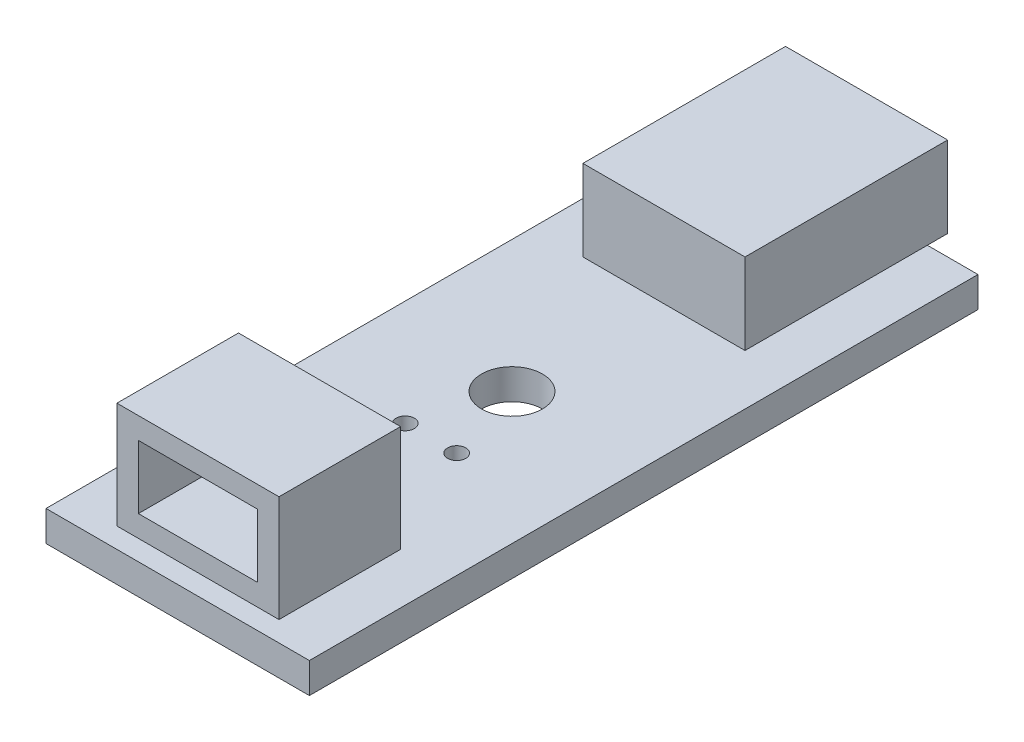
ISO-10303-21;
HEADER;
FILE_DESCRIPTION(('STEP AP214'),'2;1');
FILE_NAME('part.step','',(''),(''),'','','');
FILE_SCHEMA(('AUTOMOTIVE_DESIGN { 1 0 10303 214 1 1 1 1 }'));
ENDSEC;
DATA;
#1=APPLICATION_CONTEXT('core data for automotive mechanical design processes');
#2=APPLICATION_PROTOCOL_DEFINITION('international standard','automotive_design',2000,#1);
#3=PRODUCT_CONTEXT('',#1,'mechanical');
#4=PRODUCT('Part','Part','',(#3));
#5=PRODUCT_RELATED_PRODUCT_CATEGORY('part','',(#4));
#6=PRODUCT_DEFINITION_FORMATION('','',#4);
#7=PRODUCT_DEFINITION_CONTEXT('part definition',#1,'design');
#8=PRODUCT_DEFINITION('design','',#6,#7);
#9=PRODUCT_DEFINITION_SHAPE('','',#8);
#10=(LENGTH_UNIT() NAMED_UNIT(*) SI_UNIT(.MILLI.,.METRE.));
#11=(NAMED_UNIT(*) PLANE_ANGLE_UNIT() SI_UNIT($,.RADIAN.));
#12=(NAMED_UNIT(*) SI_UNIT($,.STERADIAN.) SOLID_ANGLE_UNIT());
#13=UNCERTAINTY_MEASURE_WITH_UNIT(LENGTH_MEASURE(1.E-05),#10,'distance_accuracy_value','');
#14=(GEOMETRIC_REPRESENTATION_CONTEXT(3) GLOBAL_UNCERTAINTY_ASSIGNED_CONTEXT((#13)) GLOBAL_UNIT_ASSIGNED_CONTEXT((#10,
#11,#12)) REPRESENTATION_CONTEXT('',''));
#15=CARTESIAN_POINT('',(0.,0.,0.));
#16=DIRECTION('',(0.,0.,1.));
#17=DIRECTION('',(1.,0.,0.));
#18=AXIS2_PLACEMENT_3D('',#15,#16,#17);
#19=CARTESIAN_POINT('',(-6.5,1.5,-16.5));
#20=DIRECTION('',(0.,0.,1.));
#21=DIRECTION('',(1.,0.,0.));
#22=AXIS2_PLACEMENT_3D('',#19,#20,#21);
#23=PLANE('',#22);
#24=DIRECTION('',(-1.,0.,0.));
#25=VECTOR('',#24,1.);
#26=CARTESIAN_POINT('',(4.,1.5,-16.5));
#27=LINE('',#26,#25);
#28=CARTESIAN_POINT('',(4.,1.5,-16.5));
#29=VERTEX_POINT('',#28);
#30=CARTESIAN_POINT('',(-4.,1.5,-16.5));
#31=VERTEX_POINT('',#30);
#32=EDGE_CURVE('E262',#29,#31,#27,.T.);
#33=ORIENTED_EDGE('',*,*,#32,.F.);
#34=DIRECTION('',(-1.,0.,0.));
#35=VECTOR('',#34,1.);
#36=CARTESIAN_POINT('',(-6.5,1.5,-16.5));
#37=LINE('',#36,#35);
#38=CARTESIAN_POINT('',(6.5,1.5,-16.5));
#39=VERTEX_POINT('',#38);
#40=EDGE_CURVE('E394',#39,#29,#37,.T.);
#41=ORIENTED_EDGE('',*,*,#40,.F.);
#42=DIRECTION('',(0.,-1.,0.));
#43=VECTOR('',#42,1.);
#44=CARTESIAN_POINT('',(6.5,1.5,-16.5));
#45=LINE('',#44,#43);
#46=CARTESIAN_POINT('',(6.5,0.,-16.5));
#47=VERTEX_POINT('',#46);
#48=EDGE_CURVE('E11',#39,#47,#45,.T.);
#49=ORIENTED_EDGE('',*,*,#48,.T.);
#50=DIRECTION('',(-1.,0.,0.));
#51=VECTOR('',#50,1.);
#52=CARTESIAN_POINT('',(-6.5,0.,-16.5));
#53=LINE('',#52,#51);
#54=CARTESIAN_POINT('',(-6.5,0.,-16.5));
#55=VERTEX_POINT('',#54);
#56=EDGE_CURVE('E404',#47,#55,#53,.T.);
#57=ORIENTED_EDGE('',*,*,#56,.T.);
#58=DIRECTION('',(0.,-1.,0.));
#59=VECTOR('',#58,1.);
#60=CARTESIAN_POINT('',(-6.5,1.5,-16.5));
#61=LINE('',#60,#59);
#62=CARTESIAN_POINT('',(-6.5,1.5,-16.5));
#63=VERTEX_POINT('',#62);
#64=EDGE_CURVE('E43',#63,#55,#61,.T.);
#65=ORIENTED_EDGE('',*,*,#64,.F.);
#66=EDGE_CURVE('E392',#31,#63,#37,.T.);
#67=ORIENTED_EDGE('',*,*,#66,.F.);
#68=EDGE_LOOP('',(#33,#41,#49,#57,#65,#67));
#69=FACE_BOUND('',#68,.T.);
#70=ADVANCED_FACE('F34',(#69),#23,.F.);
#71=CARTESIAN_POINT('',(0.,1.5,0.));
#72=DIRECTION('',(0.,-1.,0.));
#73=DIRECTION('',(0.,0.,-1.));
#74=AXIS2_PLACEMENT_3D('',#71,#72,#73);
#75=PLANE('',#74);
#76=DIRECTION('',(0.,0.,-1.));
#77=VECTOR('',#76,1.);
#78=CARTESIAN_POINT('',(4.,1.5,15.5));
#79=LINE('',#78,#77);
#80=CARTESIAN_POINT('',(4.,1.5,15.5));
#81=VERTEX_POINT('',#80);
#82=CARTESIAN_POINT('',(4.,1.5,9.5));
#83=VERTEX_POINT('',#82);
#84=EDGE_CURVE('E349',#81,#83,#79,.T.);
#85=ORIENTED_EDGE('',*,*,#84,.F.);
#86=DIRECTION('',(1.,0.,0.));
#87=VECTOR('',#86,1.);
#88=CARTESIAN_POINT('',(-4.,1.5,15.5));
#89=LINE('',#88,#87);
#90=CARTESIAN_POINT('',(-4.,1.5,15.5));
#91=VERTEX_POINT('',#90);
#92=EDGE_CURVE('E360',#91,#81,#89,.T.);
#93=ORIENTED_EDGE('',*,*,#92,.F.);
#94=DIRECTION('',(0.,0.,1.));
#95=VECTOR('',#94,1.);
#96=CARTESIAN_POINT('',(-4.,1.5,15.5));
#97=LINE('',#96,#95);
#98=CARTESIAN_POINT('',(-4.,1.5,9.5));
#99=VERTEX_POINT('',#98);
#100=EDGE_CURVE('E372',#99,#91,#97,.T.);
#101=ORIENTED_EDGE('',*,*,#100,.F.);
#102=DIRECTION('',(-1.,0.,0.));
#103=VECTOR('',#102,1.);
#104=CARTESIAN_POINT('',(-4.,1.5,9.5));
#105=LINE('',#104,#103);
#106=EDGE_CURVE('E369',#83,#99,#105,.T.);
#107=ORIENTED_EDGE('',*,*,#106,.F.);
#108=EDGE_LOOP('',(#85,#93,#101,#107));
#109=FACE_BOUND('',#108,.T.);
#110=CARTESIAN_POINT('',(0.,1.5,0.));
#111=DIRECTION('',(0.,1.,0.));
#112=DIRECTION('',(0.,0.,1.));
#113=AXIS2_PLACEMENT_3D('',#110,#111,#112);
#114=CIRCLE('',#113,1.5);
#115=CARTESIAN_POINT('',(0.,1.5,1.5));
#116=VERTEX_POINT('',#115);
#117=EDGE_CURVE('E319',#116,#116,#114,.T.);
#118=ORIENTED_EDGE('',*,*,#117,.F.);
#119=EDGE_LOOP('',(#118));
#120=FACE_BOUND('',#119,.T.);
#121=CARTESIAN_POINT('',(-1.27,1.5,4.));
#122=DIRECTION('',(0.,1.,0.));
#123=DIRECTION('',(0.,0.,1.));
#124=AXIS2_PLACEMENT_3D('',#121,#122,#123);
#125=CIRCLE('',#124,0.45);
#126=CARTESIAN_POINT('',(-1.27,1.5,4.45));
#127=VERTEX_POINT('',#126);
#128=EDGE_CURVE('E315',#127,#127,#125,.T.);
#129=ORIENTED_EDGE('',*,*,#128,.F.);
#130=EDGE_LOOP('',(#129));
#131=FACE_BOUND('',#130,.T.);
#132=CARTESIAN_POINT('',(1.27,1.5,4.));
#133=DIRECTION('',(0.,1.,0.));
#134=DIRECTION('',(0.,0.,1.));
#135=AXIS2_PLACEMENT_3D('',#132,#133,#134);
#136=CIRCLE('',#135,0.45);
#137=CARTESIAN_POINT('',(1.27,1.5,4.45));
#138=VERTEX_POINT('',#137);
#139=EDGE_CURVE('E312',#138,#138,#136,.T.);
#140=ORIENTED_EDGE('',*,*,#139,.F.);
#141=EDGE_LOOP('',(#140));
#142=FACE_BOUND('',#141,.T.);
#143=DIRECTION('',(0.,0.,1.));
#144=VECTOR('',#143,1.);
#145=CARTESIAN_POINT('',(-4.,1.5,-7.5));
#146=LINE('',#145,#144);
#147=CARTESIAN_POINT('',(-4.,1.5,-7.5));
#148=VERTEX_POINT('',#147);
#149=EDGE_CURVE('E293',#31,#148,#146,.T.);
#150=ORIENTED_EDGE('',*,*,#149,.F.);
#151=ORIENTED_EDGE('',*,*,#66,.T.);
#152=DIRECTION('',(0.,0.,1.));
#153=VECTOR('',#152,1.);
#154=CARTESIAN_POINT('',(-6.5,1.5,16.5));
#155=LINE('',#154,#153);
#156=CARTESIAN_POINT('',(-6.5,1.5,16.5));
#157=VERTEX_POINT('',#156);
#158=EDGE_CURVE('E397',#63,#157,#155,.T.);
#159=ORIENTED_EDGE('',*,*,#158,.T.);
#160=DIRECTION('',(1.,0.,0.));
#161=VECTOR('',#160,1.);
#162=CARTESIAN_POINT('',(-6.5,1.5,16.5));
#163=LINE('',#162,#161);
#164=CARTESIAN_POINT('',(6.5,1.5,16.5));
#165=VERTEX_POINT('',#164);
#166=EDGE_CURVE('E399',#157,#165,#163,.T.);
#167=ORIENTED_EDGE('',*,*,#166,.T.);
#168=DIRECTION('',(0.,0.,-1.));
#169=VECTOR('',#168,1.);
#170=CARTESIAN_POINT('',(6.5,1.5,16.5));
#171=LINE('',#170,#169);
#172=EDGE_CURVE('E389',#165,#39,#171,.T.);
#173=ORIENTED_EDGE('',*,*,#172,.T.);
#174=ORIENTED_EDGE('',*,*,#40,.T.);
#175=DIRECTION('',(0.,0.,-1.));
#176=VECTOR('',#175,1.);
#177=CARTESIAN_POINT('',(4.,1.5,-7.5));
#178=LINE('',#177,#176);
#179=CARTESIAN_POINT('',(4.,1.5,-7.5));
#180=VERTEX_POINT('',#179);
#181=EDGE_CURVE('E298',#180,#29,#178,.T.);
#182=ORIENTED_EDGE('',*,*,#181,.F.);
#183=DIRECTION('',(1.,0.,0.));
#184=VECTOR('',#183,1.);
#185=CARTESIAN_POINT('',(4.,1.5,-7.5));
#186=LINE('',#185,#184);
#187=EDGE_CURVE('E59',#148,#180,#186,.T.);
#188=ORIENTED_EDGE('',*,*,#187,.F.);
#189=EDGE_LOOP('',(#150,#151,#159,#167,#173,#174,#182,#188));
#190=FACE_BOUND('',#189,.T.);
#191=ADVANCED_FACE('F448',(#109,#120,#131,#142,#190),#75,.F.);
#192=CARTESIAN_POINT('',(6.5,1.5,16.5));
#193=DIRECTION('',(-1.,0.,0.));
#194=DIRECTION('',(0.,0.,1.));
#195=AXIS2_PLACEMENT_3D('',#192,#193,#194);
#196=PLANE('',#195);
#197=DIRECTION('',(0.,0.,-1.));
#198=VECTOR('',#197,1.);
#199=CARTESIAN_POINT('',(6.5,0.,16.5));
#200=LINE('',#199,#198);
#201=CARTESIAN_POINT('',(6.5,0.,16.5));
#202=VERTEX_POINT('',#201);
#203=EDGE_CURVE('E388',#202,#47,#200,.T.);
#204=ORIENTED_EDGE('',*,*,#203,.T.);
#205=ORIENTED_EDGE('',*,*,#48,.F.);
#206=ORIENTED_EDGE('',*,*,#172,.F.);
#207=DIRECTION('',(0.,-1.,0.));
#208=VECTOR('',#207,1.);
#209=CARTESIAN_POINT('',(6.5,1.5,16.5));
#210=LINE('',#209,#208);
#211=EDGE_CURVE('E401',#165,#202,#210,.T.);
#212=ORIENTED_EDGE('',*,*,#211,.T.);
#213=EDGE_LOOP('',(#204,#205,#206,#212));
#214=FACE_BOUND('',#213,.T.);
#215=ADVANCED_FACE('F36',(#214),#196,.F.);
#216=CARTESIAN_POINT('',(-6.5,1.5,16.5));
#217=DIRECTION('',(1.,0.,0.));
#218=DIRECTION('',(0.,0.,-1.));
#219=AXIS2_PLACEMENT_3D('',#216,#217,#218);
#220=PLANE('',#219);
#221=DIRECTION('',(0.,0.,1.));
#222=VECTOR('',#221,1.);
#223=CARTESIAN_POINT('',(-6.5,0.,16.5));
#224=LINE('',#223,#222);
#225=CARTESIAN_POINT('',(-6.5,0.,16.5));
#226=VERTEX_POINT('',#225);
#227=EDGE_CURVE('E406',#55,#226,#224,.T.);
#228=ORIENTED_EDGE('',*,*,#227,.T.);
#229=DIRECTION('',(0.,-1.,0.));
#230=VECTOR('',#229,1.);
#231=CARTESIAN_POINT('',(-6.5,1.5,16.5));
#232=LINE('',#231,#230);
#233=EDGE_CURVE('E411',#157,#226,#232,.T.);
#234=ORIENTED_EDGE('',*,*,#233,.F.);
#235=ORIENTED_EDGE('',*,*,#158,.F.);
#236=ORIENTED_EDGE('',*,*,#64,.T.);
#237=EDGE_LOOP('',(#228,#234,#235,#236));
#238=FACE_BOUND('',#237,.T.);
#239=ADVANCED_FACE('F444',(#238),#220,.F.);
#240=CARTESIAN_POINT('',(-6.5,1.5,16.5));
#241=DIRECTION('',(0.,0.,-1.));
#242=DIRECTION('',(-1.,0.,0.));
#243=AXIS2_PLACEMENT_3D('',#240,#241,#242);
#244=PLANE('',#243);
#245=DIRECTION('',(1.,0.,0.));
#246=VECTOR('',#245,1.);
#247=CARTESIAN_POINT('',(-6.5,0.,16.5));
#248=LINE('',#247,#246);
#249=EDGE_CURVE('E393',#226,#202,#248,.T.);
#250=ORIENTED_EDGE('',*,*,#249,.T.);
#251=ORIENTED_EDGE('',*,*,#211,.F.);
#252=ORIENTED_EDGE('',*,*,#166,.F.);
#253=ORIENTED_EDGE('',*,*,#233,.T.);
#254=EDGE_LOOP('',(#250,#251,#252,#253));
#255=FACE_BOUND('',#254,.T.);
#256=ADVANCED_FACE('F427',(#255),#244,.F.);
#257=CARTESIAN_POINT('',(0.,0.,0.));
#258=DIRECTION('',(0.,-1.,0.));
#259=DIRECTION('',(0.,0.,-1.));
#260=AXIS2_PLACEMENT_3D('',#257,#258,#259);
#261=PLANE('',#260);
#262=CARTESIAN_POINT('',(1.27,0.,4.));
#263=DIRECTION('',(0.,-1.,0.));
#264=DIRECTION('',(0.,0.,-1.));
#265=AXIS2_PLACEMENT_3D('',#262,#263,#264);
#266=CIRCLE('',#265,0.45);
#267=CARTESIAN_POINT('',(1.27,0.,3.55));
#268=VERTEX_POINT('',#267);
#269=EDGE_CURVE('E38',#268,#268,#266,.T.);
#270=ORIENTED_EDGE('',*,*,#269,.F.);
#271=EDGE_LOOP('',(#270));
#272=FACE_BOUND('',#271,.T.);
#273=CARTESIAN_POINT('',(-1.27,0.,4.));
#274=DIRECTION('',(0.,-1.,0.));
#275=DIRECTION('',(0.,0.,-1.));
#276=AXIS2_PLACEMENT_3D('',#273,#274,#275);
#277=CIRCLE('',#276,0.45);
#278=CARTESIAN_POINT('',(-1.27,0.,3.55));
#279=VERTEX_POINT('',#278);
#280=EDGE_CURVE('E318',#279,#279,#277,.T.);
#281=ORIENTED_EDGE('',*,*,#280,.F.);
#282=EDGE_LOOP('',(#281));
#283=FACE_BOUND('',#282,.T.);
#284=CARTESIAN_POINT('',(0.,0.,0.));
#285=DIRECTION('',(0.,-1.,0.));
#286=DIRECTION('',(0.,0.,-1.));
#287=AXIS2_PLACEMENT_3D('',#284,#285,#286);
#288=CIRCLE('',#287,1.5);
#289=CARTESIAN_POINT('',(0.,0.,-1.5));
#290=VERTEX_POINT('',#289);
#291=EDGE_CURVE('E322',#290,#290,#288,.T.);
#292=ORIENTED_EDGE('',*,*,#291,.F.);
#293=EDGE_LOOP('',(#292));
#294=FACE_BOUND('',#293,.T.);
#295=ORIENTED_EDGE('',*,*,#203,.F.);
#296=ORIENTED_EDGE('',*,*,#249,.F.);
#297=ORIENTED_EDGE('',*,*,#227,.F.);
#298=ORIENTED_EDGE('',*,*,#56,.F.);
#299=EDGE_LOOP('',(#295,#296,#297,#298));
#300=FACE_BOUND('',#299,.T.);
#301=ADVANCED_FACE('F423',(#272,#283,#294,#300),#261,.T.);
#302=CARTESIAN_POINT('',(4.,6.75,15.5));
#303=DIRECTION('',(-1.,0.,0.));
#304=DIRECTION('',(0.,0.,1.));
#305=AXIS2_PLACEMENT_3D('',#302,#303,#304);
#306=PLANE('',#305);
#307=ORIENTED_EDGE('',*,*,#84,.T.);
#308=DIRECTION('',(0.,-1.,0.));
#309=VECTOR('',#308,1.);
#310=CARTESIAN_POINT('',(4.,6.75,9.5));
#311=LINE('',#310,#309);
#312=CARTESIAN_POINT('',(4.,6.75,9.5));
#313=VERTEX_POINT('',#312);
#314=EDGE_CURVE('E385',#313,#83,#311,.T.);
#315=ORIENTED_EDGE('',*,*,#314,.F.);
#316=DIRECTION('',(0.,0.,-1.));
#317=VECTOR('',#316,1.);
#318=CARTESIAN_POINT('',(4.,6.75,15.5));
#319=LINE('',#318,#317);
#320=CARTESIAN_POINT('',(4.,6.75,15.5));
#321=VERTEX_POINT('',#320);
#322=EDGE_CURVE('E356',#321,#313,#319,.T.);
#323=ORIENTED_EDGE('',*,*,#322,.F.);
#324=DIRECTION('',(0.,-1.,0.));
#325=VECTOR('',#324,1.);
#326=CARTESIAN_POINT('',(4.,6.75,15.5));
#327=LINE('',#326,#325);
#328=EDGE_CURVE('E366',#321,#81,#327,.T.);
#329=ORIENTED_EDGE('',*,*,#328,.T.);
#330=EDGE_LOOP('',(#307,#315,#323,#329));
#331=FACE_BOUND('',#330,.T.);
#332=ADVANCED_FACE('F426',(#331),#306,.F.);
#333=CARTESIAN_POINT('',(-4.,6.75,9.5));
#334=DIRECTION('',(0.,0.,1.));
#335=DIRECTION('',(1.,0.,0.));
#336=AXIS2_PLACEMENT_3D('',#333,#334,#335);
#337=PLANE('',#336);
#338=ORIENTED_EDGE('',*,*,#106,.T.);
#339=DIRECTION('',(0.,-1.,0.));
#340=VECTOR('',#339,1.);
#341=CARTESIAN_POINT('',(-4.,6.75,9.5));
#342=LINE('',#341,#340);
#343=CARTESIAN_POINT('',(-4.,6.75,9.5));
#344=VERTEX_POINT('',#343);
#345=EDGE_CURVE('E382',#344,#99,#342,.T.);
#346=ORIENTED_EDGE('',*,*,#345,.F.);
#347=DIRECTION('',(-1.,0.,0.));
#348=VECTOR('',#347,1.);
#349=CARTESIAN_POINT('',(-4.,6.75,9.5));
#350=LINE('',#349,#348);
#351=EDGE_CURVE('E359',#313,#344,#350,.T.);
#352=ORIENTED_EDGE('',*,*,#351,.F.);
#353=ORIENTED_EDGE('',*,*,#314,.T.);
#354=EDGE_LOOP('',(#338,#346,#352,#353));
#355=FACE_BOUND('',#354,.T.);
#356=ADVANCED_FACE('F492',(#355),#337,.F.);
#357=CARTESIAN_POINT('',(-4.,6.75,15.5));
#358=DIRECTION('',(1.,0.,0.));
#359=DIRECTION('',(0.,0.,-1.));
#360=AXIS2_PLACEMENT_3D('',#357,#358,#359);
#361=PLANE('',#360);
#362=ORIENTED_EDGE('',*,*,#100,.T.);
#363=DIRECTION('',(0.,-1.,0.));
#364=VECTOR('',#363,1.);
#365=CARTESIAN_POINT('',(-4.,6.75,15.5));
#366=LINE('',#365,#364);
#367=CARTESIAN_POINT('',(-4.,6.75,15.5));
#368=VERTEX_POINT('',#367);
#369=EDGE_CURVE('E379',#368,#91,#366,.T.);
#370=ORIENTED_EDGE('',*,*,#369,.F.);
#371=DIRECTION('',(0.,0.,1.));
#372=VECTOR('',#371,1.);
#373=CARTESIAN_POINT('',(-4.,6.75,15.5));
#374=LINE('',#373,#372);
#375=EDGE_CURVE('E362',#344,#368,#374,.T.);
#376=ORIENTED_EDGE('',*,*,#375,.F.);
#377=ORIENTED_EDGE('',*,*,#345,.T.);
#378=EDGE_LOOP('',(#362,#370,#376,#377));
#379=FACE_BOUND('',#378,.T.);
#380=ADVANCED_FACE('F496',(#379),#361,.F.);
#381=CARTESIAN_POINT('',(-4.,6.75,15.5));
#382=DIRECTION('',(0.,0.,-1.));
#383=DIRECTION('',(-1.,0.,0.));
#384=AXIS2_PLACEMENT_3D('',#381,#382,#383);
#385=PLANE('',#384);
#386=DIRECTION('',(1.,0.,0.));
#387=VECTOR('',#386,1.);
#388=CARTESIAN_POINT('',(-2.93933982822017,2.56066017177982,15.5));
#389=LINE('',#388,#387);
#390=CARTESIAN_POINT('',(-2.93933982822017,2.56066017177982,15.5));
#391=VERTEX_POINT('',#390);
#392=CARTESIAN_POINT('',(2.93933982822017,2.56066017177982,15.5));
#393=VERTEX_POINT('',#392);
#394=EDGE_CURVE('E339',#391,#393,#389,.T.);
#395=ORIENTED_EDGE('',*,*,#394,.F.);
#396=DIRECTION('',(0.,-1.,0.));
#397=VECTOR('',#396,1.);
#398=CARTESIAN_POINT('',(-2.93933982822017,5.68933982822019,15.5));
#399=LINE('',#398,#397);
#400=CARTESIAN_POINT('',(-2.93933982822017,5.68933982822019,15.5));
#401=VERTEX_POINT('',#400);
#402=EDGE_CURVE('E337',#401,#391,#399,.T.);
#403=ORIENTED_EDGE('',*,*,#402,.F.);
#404=DIRECTION('',(-1.,0.,0.));
#405=VECTOR('',#404,1.);
#406=CARTESIAN_POINT('',(-2.93933982822017,5.68933982822019,15.5));
#407=LINE('',#406,#405);
#408=CARTESIAN_POINT('',(2.93933982822017,5.68933982822019,15.5));
#409=VERTEX_POINT('',#408);
#410=EDGE_CURVE('E327',#409,#401,#407,.T.);
#411=ORIENTED_EDGE('',*,*,#410,.F.);
#412=DIRECTION('',(0.,1.,0.));
#413=VECTOR('',#412,1.);
#414=CARTESIAN_POINT('',(2.93933982822017,5.68933982822019,15.5));
#415=LINE('',#414,#413);
#416=EDGE_CURVE('E342',#393,#409,#415,.T.);
#417=ORIENTED_EDGE('',*,*,#416,.F.);
#418=EDGE_LOOP('',(#395,#403,#411,#417));
#419=FACE_BOUND('',#418,.T.);
#420=ORIENTED_EDGE('',*,*,#92,.T.);
#421=ORIENTED_EDGE('',*,*,#328,.F.);
#422=DIRECTION('',(1.,0.,0.));
#423=VECTOR('',#422,1.);
#424=CARTESIAN_POINT('',(-4.,6.75,15.5));
#425=LINE('',#424,#423);
#426=EDGE_CURVE('E364',#368,#321,#425,.T.);
#427=ORIENTED_EDGE('',*,*,#426,.F.);
#428=ORIENTED_EDGE('',*,*,#369,.T.);
#429=EDGE_LOOP('',(#420,#421,#427,#428));
#430=FACE_BOUND('',#429,.T.);
#431=ADVANCED_FACE('F500',(#419,#430),#385,.F.);
#432=CARTESIAN_POINT('',(0.,6.75,0.));
#433=DIRECTION('',(0.,-1.,0.));
#434=DIRECTION('',(0.,0.,-1.));
#435=AXIS2_PLACEMENT_3D('',#432,#433,#434);
#436=PLANE('',#435);
#437=ORIENTED_EDGE('',*,*,#322,.T.);
#438=ORIENTED_EDGE('',*,*,#351,.T.);
#439=ORIENTED_EDGE('',*,*,#375,.T.);
#440=ORIENTED_EDGE('',*,*,#426,.T.);
#441=EDGE_LOOP('',(#437,#438,#439,#440));
#442=FACE_BOUND('',#441,.T.);
#443=ADVANCED_FACE('F504',(#442),#436,.F.);
#444=CARTESIAN_POINT('',(-2.93933982822017,5.68933982822019,10.5));
#445=DIRECTION('',(-1.,0.,0.));
#446=DIRECTION('',(0.,0.,1.));
#447=AXIS2_PLACEMENT_3D('',#444,#445,#446);
#448=PLANE('',#447);
#449=ORIENTED_EDGE('',*,*,#402,.T.);
#450=DIRECTION('',(0.,0.,1.));
#451=VECTOR('',#450,1.);
#452=CARTESIAN_POINT('',(-2.93933982822017,2.56066017177982,10.5));
#453=LINE('',#452,#451);
#454=CARTESIAN_POINT('',(-2.93933982822017,2.56066017177982,10.5));
#455=VERTEX_POINT('',#454);
#456=EDGE_CURVE('E336',#455,#391,#453,.T.);
#457=ORIENTED_EDGE('',*,*,#456,.F.);
#458=DIRECTION('',(0.,-1.,0.));
#459=VECTOR('',#458,1.);
#460=CARTESIAN_POINT('',(-2.93933982822017,5.68933982822019,10.5));
#461=LINE('',#460,#459);
#462=CARTESIAN_POINT('',(-2.93933982822017,5.68933982822019,10.5));
#463=VERTEX_POINT('',#462);
#464=EDGE_CURVE('E323',#463,#455,#461,.T.);
#465=ORIENTED_EDGE('',*,*,#464,.F.);
#466=DIRECTION('',(0.,0.,1.));
#467=VECTOR('',#466,1.);
#468=CARTESIAN_POINT('',(-2.93933982822017,5.68933982822019,10.5));
#469=LINE('',#468,#467);
#470=EDGE_CURVE('E347',#463,#401,#469,.T.);
#471=ORIENTED_EDGE('',*,*,#470,.T.);
#472=EDGE_LOOP('',(#449,#457,#465,#471));
#473=FACE_BOUND('',#472,.T.);
#474=ADVANCED_FACE('F508',(#473),#448,.F.);
#475=CARTESIAN_POINT('',(-2.93933982822017,5.68933982822019,10.5));
#476=DIRECTION('',(0.,1.,0.));
#477=DIRECTION('',(0.,0.,1.));
#478=AXIS2_PLACEMENT_3D('',#475,#476,#477);
#479=PLANE('',#478);
#480=ORIENTED_EDGE('',*,*,#410,.T.);
#481=ORIENTED_EDGE('',*,*,#470,.F.);
#482=DIRECTION('',(-1.,0.,0.));
#483=VECTOR('',#482,1.);
#484=CARTESIAN_POINT('',(-2.93933982822017,5.68933982822019,10.5));
#485=LINE('',#484,#483);
#486=CARTESIAN_POINT('',(2.93933982822017,5.68933982822019,10.5));
#487=VERTEX_POINT('',#486);
#488=EDGE_CURVE('E333',#487,#463,#485,.T.);
#489=ORIENTED_EDGE('',*,*,#488,.F.);
#490=DIRECTION('',(0.,0.,1.));
#491=VECTOR('',#490,1.);
#492=CARTESIAN_POINT('',(2.93933982822017,5.68933982822019,10.5));
#493=LINE('',#492,#491);
#494=EDGE_CURVE('E350',#487,#409,#493,.T.);
#495=ORIENTED_EDGE('',*,*,#494,.T.);
#496=EDGE_LOOP('',(#480,#481,#489,#495));
#497=FACE_BOUND('',#496,.T.);
#498=ADVANCED_FACE('F512',(#497),#479,.F.);
#499=CARTESIAN_POINT('',(2.93933982822017,5.68933982822019,10.5));
#500=DIRECTION('',(1.,0.,0.));
#501=DIRECTION('',(0.,0.,-1.));
#502=AXIS2_PLACEMENT_3D('',#499,#500,#501);
#503=PLANE('',#502);
#504=ORIENTED_EDGE('',*,*,#416,.T.);
#505=ORIENTED_EDGE('',*,*,#494,.F.);
#506=DIRECTION('',(0.,1.,0.));
#507=VECTOR('',#506,1.);
#508=CARTESIAN_POINT('',(2.93933982822017,5.68933982822019,10.5));
#509=LINE('',#508,#507);
#510=CARTESIAN_POINT('',(2.93933982822017,2.56066017177982,10.5));
#511=VERTEX_POINT('',#510);
#512=EDGE_CURVE('E330',#511,#487,#509,.T.);
#513=ORIENTED_EDGE('',*,*,#512,.F.);
#514=DIRECTION('',(0.,0.,1.));
#515=VECTOR('',#514,1.);
#516=CARTESIAN_POINT('',(2.93933982822017,2.56066017177982,10.5));
#517=LINE('',#516,#515);
#518=EDGE_CURVE('E352',#511,#393,#517,.T.);
#519=ORIENTED_EDGE('',*,*,#518,.T.);
#520=EDGE_LOOP('',(#504,#505,#513,#519));
#521=FACE_BOUND('',#520,.T.);
#522=ADVANCED_FACE('F518',(#521),#503,.F.);
#523=CARTESIAN_POINT('',(-2.93933982822017,2.56066017177982,10.5));
#524=DIRECTION('',(0.,-1.,0.));
#525=DIRECTION('',(0.,0.,-1.));
#526=AXIS2_PLACEMENT_3D('',#523,#524,#525);
#527=PLANE('',#526);
#528=ORIENTED_EDGE('',*,*,#394,.T.);
#529=ORIENTED_EDGE('',*,*,#518,.F.);
#530=DIRECTION('',(1.,0.,0.));
#531=VECTOR('',#530,1.);
#532=CARTESIAN_POINT('',(-2.93933982822017,2.56066017177982,10.5));
#533=LINE('',#532,#531);
#534=EDGE_CURVE('E326',#455,#511,#533,.T.);
#535=ORIENTED_EDGE('',*,*,#534,.F.);
#536=ORIENTED_EDGE('',*,*,#456,.T.);
#537=EDGE_LOOP('',(#528,#529,#535,#536));
#538=FACE_BOUND('',#537,.T.);
#539=ADVANCED_FACE('F514',(#538),#527,.F.);
#540=CARTESIAN_POINT('',(0.,0.,10.5));
#541=DIRECTION('',(0.,0.,1.));
#542=DIRECTION('',(1.,0.,0.));
#543=AXIS2_PLACEMENT_3D('',#540,#541,#542);
#544=PLANE('',#543);
#545=ORIENTED_EDGE('',*,*,#464,.T.);
#546=ORIENTED_EDGE('',*,*,#534,.T.);
#547=ORIENTED_EDGE('',*,*,#512,.T.);
#548=ORIENTED_EDGE('',*,*,#488,.T.);
#549=EDGE_LOOP('',(#545,#546,#547,#548));
#550=FACE_BOUND('',#549,.T.);
#551=ADVANCED_FACE('F517',(#550),#544,.T.);
#552=CARTESIAN_POINT('',(0.,-5.5,0.));
#553=DIRECTION('',(0.,1.,0.));
#554=DIRECTION('',(0.,0.,1.));
#555=AXIS2_PLACEMENT_3D('',#552,#553,#554);
#556=CYLINDRICAL_SURFACE('',#555,1.5);
#557=ORIENTED_EDGE('',*,*,#291,.T.);
#558=EDGE_LOOP('',(#557));
#559=FACE_BOUND('',#558,.T.);
#560=ORIENTED_EDGE('',*,*,#117,.T.);
#561=EDGE_LOOP('',(#560));
#562=FACE_BOUND('',#561,.T.);
#563=ADVANCED_FACE('F528',(#559,#562),#556,.F.);
#564=CARTESIAN_POINT('',(-1.27,-5.5,4.));
#565=DIRECTION('',(0.,1.,0.));
#566=DIRECTION('',(0.,0.,1.));
#567=AXIS2_PLACEMENT_3D('',#564,#565,#566);
#568=CYLINDRICAL_SURFACE('',#567,0.45);
#569=ORIENTED_EDGE('',*,*,#280,.T.);
#570=EDGE_LOOP('',(#569));
#571=FACE_BOUND('',#570,.T.);
#572=ORIENTED_EDGE('',*,*,#128,.T.);
#573=EDGE_LOOP('',(#572));
#574=FACE_BOUND('',#573,.T.);
#575=ADVANCED_FACE('F420',(#571,#574),#568,.F.);
#576=CARTESIAN_POINT('',(1.27,-5.5,4.));
#577=DIRECTION('',(0.,1.,0.));
#578=DIRECTION('',(0.,0.,1.));
#579=AXIS2_PLACEMENT_3D('',#576,#577,#578);
#580=CYLINDRICAL_SURFACE('',#579,0.45);
#581=ORIENTED_EDGE('',*,*,#269,.T.);
#582=EDGE_LOOP('',(#581));
#583=FACE_BOUND('',#582,.T.);
#584=ORIENTED_EDGE('',*,*,#139,.T.);
#585=EDGE_LOOP('',(#584));
#586=FACE_BOUND('',#585,.T.);
#587=ADVANCED_FACE('F535',(#583,#586),#580,.F.);
#588=CARTESIAN_POINT('',(-4.,5.5,-7.5));
#589=DIRECTION('',(1.,0.,0.));
#590=DIRECTION('',(0.,0.,-1.));
#591=AXIS2_PLACEMENT_3D('',#588,#589,#590);
#592=PLANE('',#591);
#593=ORIENTED_EDGE('',*,*,#149,.T.);
#594=DIRECTION('',(0.,-1.,0.));
#595=VECTOR('',#594,1.);
#596=CARTESIAN_POINT('',(-4.,5.5,-7.5));
#597=LINE('',#596,#595);
#598=CARTESIAN_POINT('',(-4.,5.5,-7.5));
#599=VERTEX_POINT('',#598);
#600=EDGE_CURVE('E310',#599,#148,#597,.T.);
#601=ORIENTED_EDGE('',*,*,#600,.F.);
#602=DIRECTION('',(0.,0.,1.));
#603=VECTOR('',#602,1.);
#604=CARTESIAN_POINT('',(-4.,5.5,-7.5));
#605=LINE('',#604,#603);
#606=CARTESIAN_POINT('',(-4.,5.5,-17.5));
#607=VERTEX_POINT('',#606);
#608=EDGE_CURVE('E294',#607,#599,#605,.T.);
#609=ORIENTED_EDGE('',*,*,#608,.F.);
#610=DIRECTION('',(0.,1.,0.));
#611=VECTOR('',#610,1.);
#612=CARTESIAN_POINT('',(-4.,5.5,-17.5));
#613=LINE('',#612,#611);
#614=CARTESIAN_POINT('',(-4.,1.5,-17.5));
#615=VERTEX_POINT('',#614);
#616=EDGE_CURVE('E279',#615,#607,#613,.T.);
#617=ORIENTED_EDGE('',*,*,#616,.F.);
#618=DIRECTION('',(0.,0.,1.));
#619=VECTOR('',#618,1.);
#620=CARTESIAN_POINT('',(-4.,1.5,-17.5));
#621=LINE('',#620,#619);
#622=EDGE_CURVE('E285',#615,#31,#621,.T.);
#623=ORIENTED_EDGE('',*,*,#622,.T.);
#624=EDGE_LOOP('',(#593,#601,#609,#617,#623));
#625=FACE_BOUND('',#624,.T.);
#626=ADVANCED_FACE('F451',(#625),#592,.F.);
#627=CARTESIAN_POINT('',(4.,5.5,-7.5));
#628=DIRECTION('',(0.,0.,-1.));
#629=DIRECTION('',(-1.,0.,0.));
#630=AXIS2_PLACEMENT_3D('',#627,#628,#629);
#631=PLANE('',#630);
#632=ORIENTED_EDGE('',*,*,#187,.T.);
#633=DIRECTION('',(0.,-1.,0.));
#634=VECTOR('',#633,1.);
#635=CARTESIAN_POINT('',(4.,5.5,-7.5));
#636=LINE('',#635,#634);
#637=CARTESIAN_POINT('',(4.,5.5,-7.5));
#638=VERTEX_POINT('',#637);
#639=EDGE_CURVE('E302',#638,#180,#636,.T.);
#640=ORIENTED_EDGE('',*,*,#639,.F.);
#641=DIRECTION('',(1.,0.,0.));
#642=VECTOR('',#641,1.);
#643=CARTESIAN_POINT('',(4.,5.5,-7.5));
#644=LINE('',#643,#642);
#645=EDGE_CURVE('E297',#599,#638,#644,.T.);
#646=ORIENTED_EDGE('',*,*,#645,.F.);
#647=ORIENTED_EDGE('',*,*,#600,.T.);
#648=EDGE_LOOP('',(#632,#640,#646,#647));
#649=FACE_BOUND('',#648,.T.);
#650=ADVANCED_FACE('F463',(#649),#631,.F.);
#651=CARTESIAN_POINT('',(4.,5.5,-7.5));
#652=DIRECTION('',(-1.,0.,0.));
#653=DIRECTION('',(0.,0.,1.));
#654=AXIS2_PLACEMENT_3D('',#651,#652,#653);
#655=PLANE('',#654);
#656=ORIENTED_EDGE('',*,*,#181,.T.);
#657=DIRECTION('',(0.,0.,1.));
#658=VECTOR('',#657,1.);
#659=CARTESIAN_POINT('',(4.,1.5,-17.5));
#660=LINE('',#659,#658);
#661=CARTESIAN_POINT('',(4.,1.5,-17.5));
#662=VERTEX_POINT('',#661);
#663=EDGE_CURVE('E290',#662,#29,#660,.T.);
#664=ORIENTED_EDGE('',*,*,#663,.F.);
#665=DIRECTION('',(0.,-1.,0.));
#666=VECTOR('',#665,1.);
#667=CARTESIAN_POINT('',(4.,5.5,-17.5));
#668=LINE('',#667,#666);
#669=CARTESIAN_POINT('',(4.,5.5,-17.5));
#670=VERTEX_POINT('',#669);
#671=EDGE_CURVE('E274',#670,#662,#668,.T.);
#672=ORIENTED_EDGE('',*,*,#671,.F.);
#673=DIRECTION('',(0.,0.,-1.));
#674=VECTOR('',#673,1.);
#675=CARTESIAN_POINT('',(4.,5.5,-7.5));
#676=LINE('',#675,#674);
#677=EDGE_CURVE('E300',#638,#670,#676,.T.);
#678=ORIENTED_EDGE('',*,*,#677,.F.);
#679=ORIENTED_EDGE('',*,*,#639,.T.);
#680=EDGE_LOOP('',(#656,#664,#672,#678,#679));
#681=FACE_BOUND('',#680,.T.);
#682=ADVANCED_FACE('F459',(#681),#655,.F.);
#683=CARTESIAN_POINT('',(0.,5.5,0.));
#684=DIRECTION('',(0.,1.,0.));
#685=DIRECTION('',(0.,0.,1.));
#686=AXIS2_PLACEMENT_3D('',#683,#684,#685);
#687=PLANE('',#686);
#688=ORIENTED_EDGE('',*,*,#608,.T.);
#689=ORIENTED_EDGE('',*,*,#645,.T.);
#690=ORIENTED_EDGE('',*,*,#677,.T.);
#691=DIRECTION('',(1.,0.,0.));
#692=VECTOR('',#691,1.);
#693=CARTESIAN_POINT('',(4.,5.5,-17.5));
#694=LINE('',#693,#692);
#695=EDGE_CURVE('E282',#607,#670,#694,.T.);
#696=ORIENTED_EDGE('',*,*,#695,.F.);
#697=EDGE_LOOP('',(#688,#689,#690,#696));
#698=FACE_BOUND('',#697,.T.);
#699=ADVANCED_FACE('F466',(#698),#687,.T.);
#700=CARTESIAN_POINT('',(4.,1.5,-17.5));
#701=DIRECTION('',(0.,1.,0.));
#702=DIRECTION('',(0.,0.,1.));
#703=AXIS2_PLACEMENT_3D('',#700,#701,#702);
#704=PLANE('',#703);
#705=ORIENTED_EDGE('',*,*,#32,.T.);
#706=ORIENTED_EDGE('',*,*,#622,.F.);
#707=DIRECTION('',(-1.,0.,0.));
#708=VECTOR('',#707,1.);
#709=CARTESIAN_POINT('',(4.,1.5,-17.5));
#710=LINE('',#709,#708);
#711=EDGE_CURVE('E277',#662,#615,#710,.T.);
#712=ORIENTED_EDGE('',*,*,#711,.F.);
#713=ORIENTED_EDGE('',*,*,#663,.T.);
#714=EDGE_LOOP('',(#705,#706,#712,#713));
#715=FACE_BOUND('',#714,.T.);
#716=ADVANCED_FACE('F455',(#715),#704,.F.);
#717=CARTESIAN_POINT('',(0.,0.,-17.5));
#718=DIRECTION('',(0.,0.,-1.));
#719=DIRECTION('',(-1.,0.,0.));
#720=AXIS2_PLACEMENT_3D('',#717,#718,#719);
#721=PLANE('',#720);
#722=DIRECTION('',(0.,-1.,0.));
#723=VECTOR('',#722,1.);
#724=CARTESIAN_POINT('',(3.49084989802142,5.00909725960241,-17.5));
#725=LINE('',#724,#723);
#726=CARTESIAN_POINT('',(3.49084989802142,5.00909725960241,-17.5));
#727=VERTEX_POINT('',#726);
#728=CARTESIAN_POINT('',(3.49084989802142,3.75909725960253,-17.5));
#729=VERTEX_POINT('',#728);
#730=EDGE_CURVE('E51',#727,#729,#725,.T.);
#731=ORIENTED_EDGE('',*,*,#730,.F.);
#732=DIRECTION('',(1.,0.,0.));
#733=VECTOR('',#732,1.);
#734=CARTESIAN_POINT('',(3.49084989802142,5.00909725960241,-17.5));
#735=LINE('',#734,#733);
#736=CARTESIAN_POINT('',(-3.5091501019787,5.00909725960241,-17.5));
#737=VERTEX_POINT('',#736);
#738=EDGE_CURVE('E224',#737,#727,#735,.T.);
#739=ORIENTED_EDGE('',*,*,#738,.F.);
#740=DIRECTION('',(0.,1.,0.));
#741=VECTOR('',#740,1.);
#742=CARTESIAN_POINT('',(-3.5091501019787,5.00909725960241,-17.5));
#743=LINE('',#742,#741);
#744=CARTESIAN_POINT('',(-3.5091501019787,3.75909725960248,-17.5));
#745=VERTEX_POINT('',#744);
#746=EDGE_CURVE('E227',#745,#737,#743,.T.);
#747=ORIENTED_EDGE('',*,*,#746,.F.);
#748=DIRECTION('',(-0.55470019622523,0.832050294337843,0.));
#749=VECTOR('',#748,1.);
#750=CARTESIAN_POINT('',(-3.5091501019787,3.75909725960248,-17.5));
#751=LINE('',#750,#749);
#752=CARTESIAN_POINT('',(-3.00915010197867,3.00909725960243,-17.5));
#753=VERTEX_POINT('',#752);
#754=EDGE_CURVE('E255',#753,#745,#751,.T.);
#755=ORIENTED_EDGE('',*,*,#754,.F.);
#756=DIRECTION('',(0.,1.,0.));
#757=VECTOR('',#756,1.);
#758=CARTESIAN_POINT('',(-3.00915010197867,3.00909725960243,-17.5));
#759=LINE('',#758,#757);
#760=CARTESIAN_POINT('',(-3.00915010197867,2.00909725960241,-17.5));
#761=VERTEX_POINT('',#760);
#762=EDGE_CURVE('E252',#761,#753,#759,.T.);
#763=ORIENTED_EDGE('',*,*,#762,.F.);
#764=DIRECTION('',(-1.,0.,0.));
#765=VECTOR('',#764,1.);
#766=CARTESIAN_POINT('',(2.9908498980211,2.00909725960241,-17.5));
#767=LINE('',#766,#765);
#768=CARTESIAN_POINT('',(2.9908498980211,2.00909725960241,-17.5));
#769=VERTEX_POINT('',#768);
#770=EDGE_CURVE('E249',#769,#761,#767,.T.);
#771=ORIENTED_EDGE('',*,*,#770,.F.);
#772=DIRECTION('',(0.,-1.,0.));
#773=VECTOR('',#772,1.);
#774=CARTESIAN_POINT('',(2.9908498980211,3.00909725960206,-17.5));
#775=LINE('',#774,#773);
#776=CARTESIAN_POINT('',(2.9908498980211,3.00909725960206,-17.5));
#777=VERTEX_POINT('',#776);
#778=EDGE_CURVE('E246',#777,#769,#775,.T.);
#779=ORIENTED_EDGE('',*,*,#778,.F.);
#780=DIRECTION('',(-0.554700196225231,-0.832050294337842,0.));
#781=VECTOR('',#780,1.);
#782=CARTESIAN_POINT('',(3.49084989802142,3.75909725960253,-17.5));
#783=LINE('',#782,#781);
#784=EDGE_CURVE('E244',#729,#777,#783,.T.);
#785=ORIENTED_EDGE('',*,*,#784,.F.);
#786=EDGE_LOOP('',(#731,#739,#747,#755,#763,#771,#779,#785));
#787=FACE_BOUND('',#786,.T.);
#788=ORIENTED_EDGE('',*,*,#671,.T.);
#789=ORIENTED_EDGE('',*,*,#711,.T.);
#790=ORIENTED_EDGE('',*,*,#616,.T.);
#791=ORIENTED_EDGE('',*,*,#695,.T.);
#792=EDGE_LOOP('',(#788,#789,#790,#791));
#793=FACE_BOUND('',#792,.T.);
#794=ADVANCED_FACE('F468',(#787,#793),#721,.T.);
#795=CARTESIAN_POINT('',(3.49084989802142,5.00909725960241,-12.5));
#796=DIRECTION('',(1.,0.,0.));
#797=DIRECTION('',(0.,0.,-1.));
#798=AXIS2_PLACEMENT_3D('',#795,#796,#797);
#799=PLANE('',#798);
#800=ORIENTED_EDGE('',*,*,#730,.T.);
#801=DIRECTION('',(0.,0.,-1.));
#802=VECTOR('',#801,1.);
#803=CARTESIAN_POINT('',(3.49084989802142,3.75909725960253,-12.5));
#804=LINE('',#803,#802);
#805=CARTESIAN_POINT('',(3.49084989802142,3.75909725960253,-12.5));
#806=VERTEX_POINT('',#805);
#807=EDGE_CURVE('E201',#806,#729,#804,.T.);
#808=ORIENTED_EDGE('',*,*,#807,.F.);
#809=DIRECTION('',(0.,-1.,0.));
#810=VECTOR('',#809,1.);
#811=CARTESIAN_POINT('',(3.49084989802142,5.00909725960241,-12.5));
#812=LINE('',#811,#810);
#813=CARTESIAN_POINT('',(3.49084989802142,5.00909725960241,-12.5));
#814=VERTEX_POINT('',#813);
#815=EDGE_CURVE('E205',#814,#806,#812,.T.);
#816=ORIENTED_EDGE('',*,*,#815,.F.);
#817=DIRECTION('',(0.,0.,-1.));
#818=VECTOR('',#817,1.);
#819=CARTESIAN_POINT('',(3.49084989802142,5.00909725960241,-12.5));
#820=LINE('',#819,#818);
#821=EDGE_CURVE('E260',#814,#727,#820,.T.);
#822=ORIENTED_EDGE('',*,*,#821,.T.);
#823=EDGE_LOOP('',(#800,#808,#816,#822));
#824=FACE_BOUND('',#823,.T.);
#825=ADVANCED_FACE('F203',(#824),#799,.F.);
#826=CARTESIAN_POINT('',(3.49084989802142,5.00909725960241,-12.5));
#827=DIRECTION('',(0.,1.,0.));
#828=DIRECTION('',(0.,0.,1.));
#829=AXIS2_PLACEMENT_3D('',#826,#827,#828);
#830=PLANE('',#829);
#831=ORIENTED_EDGE('',*,*,#738,.T.);
#832=ORIENTED_EDGE('',*,*,#821,.F.);
#833=DIRECTION('',(1.,0.,0.));
#834=VECTOR('',#833,1.);
#835=CARTESIAN_POINT('',(3.49084989802142,5.00909725960241,-12.5));
#836=LINE('',#835,#834);
#837=CARTESIAN_POINT('',(-3.5091501019787,5.00909725960241,-12.5));
#838=VERTEX_POINT('',#837);
#839=EDGE_CURVE('E211',#838,#814,#836,.T.);
#840=ORIENTED_EDGE('',*,*,#839,.F.);
#841=DIRECTION('',(0.,0.,-1.));
#842=VECTOR('',#841,1.);
#843=CARTESIAN_POINT('',(-3.5091501019787,5.00909725960241,-12.5));
#844=LINE('',#843,#842);
#845=EDGE_CURVE('E263',#838,#737,#844,.T.);
#846=ORIENTED_EDGE('',*,*,#845,.T.);
#847=EDGE_LOOP('',(#831,#832,#840,#846));
#848=FACE_BOUND('',#847,.T.);
#849=ADVANCED_FACE('F476',(#848),#830,.F.);
#850=CARTESIAN_POINT('',(-3.5091501019787,5.00909725960241,-12.5));
#851=DIRECTION('',(-1.,0.,0.));
#852=DIRECTION('',(0.,0.,1.));
#853=AXIS2_PLACEMENT_3D('',#850,#851,#852);
#854=PLANE('',#853);
#855=ORIENTED_EDGE('',*,*,#746,.T.);
#856=ORIENTED_EDGE('',*,*,#845,.F.);
#857=DIRECTION('',(0.,1.,0.));
#858=VECTOR('',#857,1.);
#859=CARTESIAN_POINT('',(-3.5091501019787,5.00909725960241,-12.5));
#860=LINE('',#859,#858);
#861=CARTESIAN_POINT('',(-3.5091501019787,3.75909725960248,-12.5));
#862=VERTEX_POINT('',#861);
#863=EDGE_CURVE('E240',#862,#838,#860,.T.);
#864=ORIENTED_EDGE('',*,*,#863,.F.);
#865=DIRECTION('',(0.,0.,-1.));
#866=VECTOR('',#865,1.);
#867=CARTESIAN_POINT('',(-3.5091501019787,3.75909725960248,-12.5));
#868=LINE('',#867,#866);
#869=EDGE_CURVE('E265',#862,#745,#868,.T.);
#870=ORIENTED_EDGE('',*,*,#869,.T.);
#871=EDGE_LOOP('',(#855,#856,#864,#870));
#872=FACE_BOUND('',#871,.T.);
#873=ADVANCED_FACE('F584',(#872),#854,.F.);
#874=CARTESIAN_POINT('',(-3.5091501019787,3.75909725960248,-12.5));
#875=DIRECTION('',(-0.832050294337843,-0.55470019622523,0.));
#876=DIRECTION('',(0.55470019622523,-0.832050294337843,0.));
#877=AXIS2_PLACEMENT_3D('',#874,#875,#876);
#878=PLANE('',#877);
#879=ORIENTED_EDGE('',*,*,#754,.T.);
#880=ORIENTED_EDGE('',*,*,#869,.F.);
#881=DIRECTION('',(-0.55470019622523,0.832050294337843,0.));
#882=VECTOR('',#881,1.);
#883=CARTESIAN_POINT('',(-3.5091501019787,3.75909725960248,-12.5));
#884=LINE('',#883,#882);
#885=CARTESIAN_POINT('',(-3.00915010197867,3.00909725960243,-12.5));
#886=VERTEX_POINT('',#885);
#887=EDGE_CURVE('E237',#886,#862,#884,.T.);
#888=ORIENTED_EDGE('',*,*,#887,.F.);
#889=DIRECTION('',(0.,0.,-1.));
#890=VECTOR('',#889,1.);
#891=CARTESIAN_POINT('',(-3.00915010197867,3.00909725960243,-12.5));
#892=LINE('',#891,#890);
#893=EDGE_CURVE('E267',#886,#753,#892,.T.);
#894=ORIENTED_EDGE('',*,*,#893,.T.);
#895=EDGE_LOOP('',(#879,#880,#888,#894));
#896=FACE_BOUND('',#895,.T.);
#897=ADVANCED_FACE('F595',(#896),#878,.F.);
#898=CARTESIAN_POINT('',(-3.00915010197867,3.00909725960243,-12.5));
#899=DIRECTION('',(-1.,0.,0.));
#900=DIRECTION('',(0.,-1.,0.));
#901=AXIS2_PLACEMENT_3D('',#898,#899,#900);
#902=PLANE('',#901);
#903=ORIENTED_EDGE('',*,*,#762,.T.);
#904=ORIENTED_EDGE('',*,*,#893,.F.);
#905=DIRECTION('',(0.,1.,0.));
#906=VECTOR('',#905,1.);
#907=CARTESIAN_POINT('',(-3.00915010197867,3.00909725960243,-12.5));
#908=LINE('',#907,#906);
#909=CARTESIAN_POINT('',(-3.00915010197867,2.00909725960241,-12.5));
#910=VERTEX_POINT('',#909);
#911=EDGE_CURVE('E234',#910,#886,#908,.T.);
#912=ORIENTED_EDGE('',*,*,#911,.F.);
#913=DIRECTION('',(0.,0.,-1.));
#914=VECTOR('',#913,1.);
#915=CARTESIAN_POINT('',(-3.00915010197867,2.00909725960241,-12.5));
#916=LINE('',#915,#914);
#917=EDGE_CURVE('E269',#910,#761,#916,.T.);
#918=ORIENTED_EDGE('',*,*,#917,.T.);
#919=EDGE_LOOP('',(#903,#904,#912,#918));
#920=FACE_BOUND('',#919,.T.);
#921=ADVANCED_FACE('F606',(#920),#902,.F.);
#922=CARTESIAN_POINT('',(2.9908498980211,2.00909725960241,-12.5));
#923=DIRECTION('',(0.,-1.,0.));
#924=DIRECTION('',(0.,0.,-1.));
#925=AXIS2_PLACEMENT_3D('',#922,#923,#924);
#926=PLANE('',#925);
#927=ORIENTED_EDGE('',*,*,#770,.T.);
#928=ORIENTED_EDGE('',*,*,#917,.F.);
#929=DIRECTION('',(-1.,0.,0.));
#930=VECTOR('',#929,1.);
#931=CARTESIAN_POINT('',(2.9908498980211,2.00909725960241,-12.5));
#932=LINE('',#931,#930);
#933=CARTESIAN_POINT('',(2.9908498980211,2.00909725960241,-12.5));
#934=VERTEX_POINT('',#933);
#935=EDGE_CURVE('E231',#934,#910,#932,.T.);
#936=ORIENTED_EDGE('',*,*,#935,.F.);
#937=DIRECTION('',(0.,0.,-1.));
#938=VECTOR('',#937,1.);
#939=CARTESIAN_POINT('',(2.9908498980211,2.00909725960241,-12.5));
#940=LINE('',#939,#938);
#941=EDGE_CURVE('E271',#934,#769,#940,.T.);
#942=ORIENTED_EDGE('',*,*,#941,.T.);
#943=EDGE_LOOP('',(#927,#928,#936,#942));
#944=FACE_BOUND('',#943,.T.);
#945=ADVANCED_FACE('F617',(#944),#926,.F.);
#946=CARTESIAN_POINT('',(2.9908498980211,3.00909725960206,-12.5));
#947=DIRECTION('',(1.,0.,0.));
#948=DIRECTION('',(0.,0.,-1.));
#949=AXIS2_PLACEMENT_3D('',#946,#947,#948);
#950=PLANE('',#949);
#951=ORIENTED_EDGE('',*,*,#778,.T.);
#952=ORIENTED_EDGE('',*,*,#941,.F.);
#953=DIRECTION('',(0.,-1.,0.));
#954=VECTOR('',#953,1.);
#955=CARTESIAN_POINT('',(2.9908498980211,3.00909725960206,-12.5));
#956=LINE('',#955,#954);
#957=CARTESIAN_POINT('',(2.9908498980211,3.00909725960206,-12.5));
#958=VERTEX_POINT('',#957);
#959=EDGE_CURVE('E219',#958,#934,#956,.T.);
#960=ORIENTED_EDGE('',*,*,#959,.F.);
#961=DIRECTION('',(0.,0.,-1.));
#962=VECTOR('',#961,1.);
#963=CARTESIAN_POINT('',(2.9908498980211,3.00909725960206,-12.5));
#964=LINE('',#963,#962);
#965=EDGE_CURVE('E210',#958,#777,#964,.T.);
#966=ORIENTED_EDGE('',*,*,#965,.T.);
#967=EDGE_LOOP('',(#951,#952,#960,#966));
#968=FACE_BOUND('',#967,.T.);
#969=ADVANCED_FACE('F627',(#968),#950,.F.);
#970=CARTESIAN_POINT('',(3.49084989802142,3.75909725960253,-12.5));
#971=DIRECTION('',(0.832050294337842,-0.554700196225231,0.));
#972=DIRECTION('',(0.554700196225231,0.832050294337842,0.));
#973=AXIS2_PLACEMENT_3D('',#970,#971,#972);
#974=PLANE('',#973);
#975=ORIENTED_EDGE('',*,*,#784,.T.);
#976=ORIENTED_EDGE('',*,*,#965,.F.);
#977=DIRECTION('',(-0.554700196225231,-0.832050294337842,0.));
#978=VECTOR('',#977,1.);
#979=CARTESIAN_POINT('',(3.49084989802142,3.75909725960253,-12.5));
#980=LINE('',#979,#978);
#981=EDGE_CURVE('E214',#806,#958,#980,.T.);
#982=ORIENTED_EDGE('',*,*,#981,.F.);
#983=ORIENTED_EDGE('',*,*,#807,.T.);
#984=EDGE_LOOP('',(#975,#976,#982,#983));
#985=FACE_BOUND('',#984,.T.);
#986=ADVANCED_FACE('F215',(#985),#974,.F.);
#987=CARTESIAN_POINT('',(0.,0.,-12.5));
#988=DIRECTION('',(0.,0.,-1.));
#989=DIRECTION('',(-1.,0.,0.));
#990=AXIS2_PLACEMENT_3D('',#987,#988,#989);
#991=PLANE('',#990);
#992=ORIENTED_EDGE('',*,*,#815,.T.);
#993=ORIENTED_EDGE('',*,*,#981,.T.);
#994=ORIENTED_EDGE('',*,*,#959,.T.);
#995=ORIENTED_EDGE('',*,*,#935,.T.);
#996=ORIENTED_EDGE('',*,*,#911,.T.);
#997=ORIENTED_EDGE('',*,*,#887,.T.);
#998=ORIENTED_EDGE('',*,*,#863,.T.);
#999=ORIENTED_EDGE('',*,*,#839,.T.);
#1000=EDGE_LOOP('',(#992,#993,#994,#995,#996,#997,#998,#999));
#1001=FACE_BOUND('',#1000,.T.);
#1002=ADVANCED_FACE('F221',(#1001),#991,.T.);
#1003=CLOSED_SHELL('',(#70,#191,#215,#239,#256,#301,#332,#356,#380,#431,#443,#474,#498,#522,
#539,#551,#563,#575,#587,#626,#650,#682,#699,#716,#794,#825,#849,#873,#897,#921,#945,#969,#986,#1002));
#1004=MANIFOLD_SOLID_BREP('B2',#1003);
#1005=ADVANCED_BREP_SHAPE_REPRESENTATION('',(#18,#1004),#14);
#1006=SHAPE_DEFINITION_REPRESENTATION(#9,#1005);
ENDSEC;
END-ISO-10303-21;
